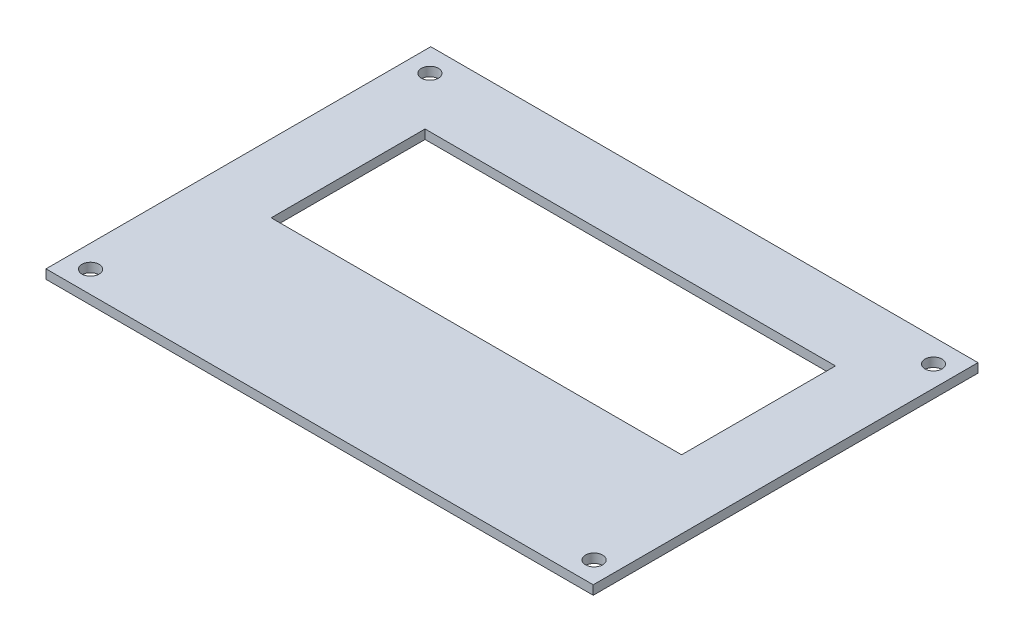
ISO-10303-21;
HEADER;
FILE_DESCRIPTION(('STEP AP214'),'2;1');
FILE_NAME('part.step','',(''),(''),'','','');
FILE_SCHEMA(('AUTOMOTIVE_DESIGN { 1 0 10303 214 1 1 1 1 }'));
ENDSEC;
DATA;
#1=APPLICATION_CONTEXT('core data for automotive mechanical design processes');
#2=APPLICATION_PROTOCOL_DEFINITION('international standard','automotive_design',2000,#1);
#3=PRODUCT_CONTEXT('',#1,'mechanical');
#4=PRODUCT('Part','Part','',(#3));
#5=PRODUCT_RELATED_PRODUCT_CATEGORY('part','',(#4));
#6=PRODUCT_DEFINITION_FORMATION('','',#4);
#7=PRODUCT_DEFINITION_CONTEXT('part definition',#1,'design');
#8=PRODUCT_DEFINITION('design','',#6,#7);
#9=PRODUCT_DEFINITION_SHAPE('','',#8);
#10=(LENGTH_UNIT() NAMED_UNIT(*) SI_UNIT(.MILLI.,.METRE.));
#11=(NAMED_UNIT(*) PLANE_ANGLE_UNIT() SI_UNIT($,.RADIAN.));
#12=(NAMED_UNIT(*) SI_UNIT($,.STERADIAN.) SOLID_ANGLE_UNIT());
#13=UNCERTAINTY_MEASURE_WITH_UNIT(LENGTH_MEASURE(1.E-05),#10,'distance_accuracy_value','');
#14=(GEOMETRIC_REPRESENTATION_CONTEXT(3) GLOBAL_UNCERTAINTY_ASSIGNED_CONTEXT((#13)) GLOBAL_UNIT_ASSIGNED_CONTEXT((#10,
#11,#12)) REPRESENTATION_CONTEXT('',''));
#15=CARTESIAN_POINT('',(0.,0.,0.));
#16=DIRECTION('',(0.,0.,1.));
#17=DIRECTION('',(1.,0.,0.));
#18=AXIS2_PLACEMENT_3D('',#15,#16,#17);
#19=CARTESIAN_POINT('',(0.,1.6,0.));
#20=DIRECTION('',(0.,0.,-1.));
#21=DIRECTION('',(-1.,0.,0.));
#22=AXIS2_PLACEMENT_3D('',#19,#20,#21);
#23=PLANE('',#22);
#24=DIRECTION('',(1.,0.,0.));
#25=VECTOR('',#24,1.);
#26=CARTESIAN_POINT('',(0.,0.,0.));
#27=LINE('',#26,#25);
#28=CARTESIAN_POINT('',(0.,0.,0.));
#29=VERTEX_POINT('',#28);
#30=CARTESIAN_POINT('',(96.,0.,0.));
#31=VERTEX_POINT('',#30);
#32=EDGE_CURVE('E182',#29,#31,#27,.T.);
#33=ORIENTED_EDGE('',*,*,#32,.T.);
#34=DIRECTION('',(0.,-1.,0.));
#35=VECTOR('',#34,1.);
#36=CARTESIAN_POINT('',(96.,1.6,0.));
#37=LINE('',#36,#35);
#38=CARTESIAN_POINT('',(96.,1.6,0.));
#39=VERTEX_POINT('',#38);
#40=EDGE_CURVE('E11',#39,#31,#37,.T.);
#41=ORIENTED_EDGE('',*,*,#40,.F.);
#42=DIRECTION('',(1.,0.,0.));
#43=VECTOR('',#42,1.);
#44=CARTESIAN_POINT('',(0.,1.6,0.));
#45=LINE('',#44,#43);
#46=CARTESIAN_POINT('',(0.,1.6,0.));
#47=VERTEX_POINT('',#46);
#48=EDGE_CURVE('E183',#47,#39,#45,.T.);
#49=ORIENTED_EDGE('',*,*,#48,.F.);
#50=DIRECTION('',(0.,-1.,0.));
#51=VECTOR('',#50,1.);
#52=CARTESIAN_POINT('',(0.,1.6,0.));
#53=LINE('',#52,#51);
#54=EDGE_CURVE('E199',#47,#29,#53,.T.);
#55=ORIENTED_EDGE('',*,*,#54,.T.);
#56=EDGE_LOOP('',(#33,#41,#49,#55));
#57=FACE_BOUND('',#56,.T.);
#58=ADVANCED_FACE('F37',(#57),#23,.F.);
#59=CARTESIAN_POINT('',(96.,1.6,0.));
#60=DIRECTION('',(-1.,0.,0.));
#61=DIRECTION('',(0.,0.,1.));
#62=AXIS2_PLACEMENT_3D('',#59,#60,#61);
#63=PLANE('',#62);
#64=DIRECTION('',(0.,0.,-1.));
#65=VECTOR('',#64,1.);
#66=CARTESIAN_POINT('',(96.,0.,0.));
#67=LINE('',#66,#65);
#68=CARTESIAN_POINT('',(96.,0.,-67.5));
#69=VERTEX_POINT('',#68);
#70=EDGE_CURVE('E203',#31,#69,#67,.T.);
#71=ORIENTED_EDGE('',*,*,#70,.T.);
#72=DIRECTION('',(0.,-1.,0.));
#73=VECTOR('',#72,1.);
#74=CARTESIAN_POINT('',(96.,1.6,-67.5));
#75=LINE('',#74,#73);
#76=CARTESIAN_POINT('',(96.,1.6,-67.5));
#77=VERTEX_POINT('',#76);
#78=EDGE_CURVE('E45',#77,#69,#75,.T.);
#79=ORIENTED_EDGE('',*,*,#78,.F.);
#80=DIRECTION('',(0.,0.,-1.));
#81=VECTOR('',#80,1.);
#82=CARTESIAN_POINT('',(96.,1.6,0.));
#83=LINE('',#82,#81);
#84=EDGE_CURVE('E187',#39,#77,#83,.T.);
#85=ORIENTED_EDGE('',*,*,#84,.F.);
#86=ORIENTED_EDGE('',*,*,#40,.T.);
#87=EDGE_LOOP('',(#71,#79,#85,#86));
#88=FACE_BOUND('',#87,.T.);
#89=ADVANCED_FACE('F225',(#88),#63,.F.);
#90=CARTESIAN_POINT('',(0.,1.6,-67.5));
#91=DIRECTION('',(0.,0.,-1.));
#92=DIRECTION('',(-1.,0.,0.));
#93=AXIS2_PLACEMENT_3D('',#90,#91,#92);
#94=PLANE('',#93);
#95=DIRECTION('',(1.,0.,0.));
#96=VECTOR('',#95,1.);
#97=CARTESIAN_POINT('',(0.,0.,-67.5));
#98=LINE('',#97,#96);
#99=CARTESIAN_POINT('',(0.,0.,-67.5));
#100=VERTEX_POINT('',#99);
#101=EDGE_CURVE('E207',#100,#69,#98,.T.);
#102=ORIENTED_EDGE('',*,*,#101,.F.);
#103=DIRECTION('',(0.,-1.,0.));
#104=VECTOR('',#103,1.);
#105=CARTESIAN_POINT('',(0.,1.6,-67.5));
#106=LINE('',#105,#104);
#107=CARTESIAN_POINT('',(0.,1.6,-67.5));
#108=VERTEX_POINT('',#107);
#109=EDGE_CURVE('E216',#108,#100,#106,.T.);
#110=ORIENTED_EDGE('',*,*,#109,.F.);
#111=DIRECTION('',(1.,0.,0.));
#112=VECTOR('',#111,1.);
#113=CARTESIAN_POINT('',(0.,1.6,-67.5));
#114=LINE('',#113,#112);
#115=EDGE_CURVE('E191',#108,#77,#114,.T.);
#116=ORIENTED_EDGE('',*,*,#115,.T.);
#117=ORIENTED_EDGE('',*,*,#78,.T.);
#118=EDGE_LOOP('',(#102,#110,#116,#117));
#119=FACE_BOUND('',#118,.T.);
#120=ADVANCED_FACE('F222',(#119),#94,.T.);
#121=CARTESIAN_POINT('',(0.,1.6,0.));
#122=DIRECTION('',(-1.,0.,0.));
#123=DIRECTION('',(0.,0.,1.));
#124=AXIS2_PLACEMENT_3D('',#121,#122,#123);
#125=PLANE('',#124);
#126=DIRECTION('',(0.,0.,-1.));
#127=VECTOR('',#126,1.);
#128=CARTESIAN_POINT('',(0.,0.,0.));
#129=LINE('',#128,#127);
#130=EDGE_CURVE('E188',#29,#100,#129,.T.);
#131=ORIENTED_EDGE('',*,*,#130,.F.);
#132=ORIENTED_EDGE('',*,*,#54,.F.);
#133=DIRECTION('',(0.,0.,-1.));
#134=VECTOR('',#133,1.);
#135=CARTESIAN_POINT('',(0.,1.6,0.));
#136=LINE('',#135,#134);
#137=EDGE_CURVE('E195',#47,#108,#136,.T.);
#138=ORIENTED_EDGE('',*,*,#137,.T.);
#139=ORIENTED_EDGE('',*,*,#109,.T.);
#140=EDGE_LOOP('',(#131,#132,#138,#139));
#141=FACE_BOUND('',#140,.T.);
#142=ADVANCED_FACE('F231',(#141),#125,.T.);
#143=CARTESIAN_POINT('',(0.,1.6,0.));
#144=DIRECTION('',(0.,1.,0.));
#145=DIRECTION('',(0.,0.,1.));
#146=AXIS2_PLACEMENT_3D('',#143,#144,#145);
#147=PLANE('',#146);
#148=DIRECTION('',(0.,0.,1.));
#149=VECTOR('',#148,1.);
#150=CARTESIAN_POINT('',(12.,1.6,0.));
#151=LINE('',#150,#149);
#152=CARTESIAN_POINT('',(12.,1.6,-54.5));
#153=VERTEX_POINT('',#152);
#154=CARTESIAN_POINT('',(12.,1.6,-27.5));
#155=VERTEX_POINT('',#154);
#156=EDGE_CURVE('E108',#153,#155,#151,.T.);
#157=ORIENTED_EDGE('',*,*,#156,.F.);
#158=DIRECTION('',(-1.,0.,0.));
#159=VECTOR('',#158,1.);
#160=CARTESIAN_POINT('',(0.,1.6,-54.5));
#161=LINE('',#160,#159);
#162=CARTESIAN_POINT('',(84.,1.6,-54.5));
#163=VERTEX_POINT('',#162);
#164=EDGE_CURVE('E147',#163,#153,#161,.T.);
#165=ORIENTED_EDGE('',*,*,#164,.F.);
#166=DIRECTION('',(0.,0.,-1.));
#167=VECTOR('',#166,1.);
#168=CARTESIAN_POINT('',(83.9999999999999,1.6,0.));
#169=LINE('',#168,#167);
#170=CARTESIAN_POINT('',(84.,1.6,-27.5));
#171=VERTEX_POINT('',#170);
#172=EDGE_CURVE('E144',#171,#163,#169,.T.);
#173=ORIENTED_EDGE('',*,*,#172,.F.);
#174=DIRECTION('',(1.,0.,0.));
#175=VECTOR('',#174,1.);
#176=CARTESIAN_POINT('',(0.,1.6,-27.5));
#177=LINE('',#176,#175);
#178=EDGE_CURVE('E135',#155,#171,#177,.T.);
#179=ORIENTED_EDGE('',*,*,#178,.F.);
#180=EDGE_LOOP('',(#157,#165,#173,#179));
#181=FACE_BOUND('',#180,.T.);
#182=CARTESIAN_POINT('',(92.3,1.6,-3.85));
#183=DIRECTION('',(0.,1.,0.));
#184=DIRECTION('',(0.,0.,1.));
#185=AXIS2_PLACEMENT_3D('',#182,#183,#184);
#186=CIRCLE('',#185,1.5);
#187=CARTESIAN_POINT('',(92.3,1.6,-2.35));
#188=VERTEX_POINT('',#187);
#189=EDGE_CURVE('E160',#188,#188,#186,.T.);
#190=ORIENTED_EDGE('',*,*,#189,.F.);
#191=EDGE_LOOP('',(#190));
#192=FACE_BOUND('',#191,.T.);
#193=CARTESIAN_POINT('',(3.96000000000002,1.6,-63.39));
#194=DIRECTION('',(0.,1.,0.));
#195=DIRECTION('',(0.,0.,1.));
#196=AXIS2_PLACEMENT_3D('',#193,#194,#195);
#197=CIRCLE('',#196,1.5);
#198=CARTESIAN_POINT('',(3.96000000000002,1.6,-61.89));
#199=VERTEX_POINT('',#198);
#200=EDGE_CURVE('E159',#199,#199,#197,.T.);
#201=ORIENTED_EDGE('',*,*,#200,.F.);
#202=EDGE_LOOP('',(#201));
#203=FACE_BOUND('',#202,.T.);
#204=CARTESIAN_POINT('',(92.3,1.6,-63.39));
#205=DIRECTION('',(0.,1.,0.));
#206=DIRECTION('',(0.,0.,1.));
#207=AXIS2_PLACEMENT_3D('',#204,#205,#206);
#208=CIRCLE('',#207,1.5);
#209=CARTESIAN_POINT('',(92.3,1.6,-61.89));
#210=VERTEX_POINT('',#209);
#211=EDGE_CURVE('E152',#210,#210,#208,.T.);
#212=ORIENTED_EDGE('',*,*,#211,.F.);
#213=EDGE_LOOP('',(#212));
#214=FACE_BOUND('',#213,.T.);
#215=CARTESIAN_POINT('',(3.96,1.6,-3.85));
#216=DIRECTION('',(0.,1.,0.));
#217=DIRECTION('',(0.,0.,1.));
#218=AXIS2_PLACEMENT_3D('',#215,#216,#217);
#219=CIRCLE('',#218,1.5);
#220=CARTESIAN_POINT('',(3.96,1.6,-2.35));
#221=VERTEX_POINT('',#220);
#222=EDGE_CURVE('E168',#221,#221,#219,.T.);
#223=ORIENTED_EDGE('',*,*,#222,.F.);
#224=EDGE_LOOP('',(#223));
#225=FACE_BOUND('',#224,.T.);
#226=ORIENTED_EDGE('',*,*,#48,.T.);
#227=ORIENTED_EDGE('',*,*,#84,.T.);
#228=ORIENTED_EDGE('',*,*,#115,.F.);
#229=ORIENTED_EDGE('',*,*,#137,.F.);
#230=EDGE_LOOP('',(#226,#227,#228,#229));
#231=FACE_BOUND('',#230,.T.);
#232=ADVANCED_FACE('F235',(#181,#192,#203,#214,#225,#231),#147,.T.);
#233=CARTESIAN_POINT('',(0.,0.,0.));
#234=DIRECTION('',(0.,1.,0.));
#235=DIRECTION('',(0.,0.,1.));
#236=AXIS2_PLACEMENT_3D('',#233,#234,#235);
#237=PLANE('',#236);
#238=DIRECTION('',(-1.,0.,0.));
#239=VECTOR('',#238,1.);
#240=CARTESIAN_POINT('',(12.,0.,-54.5));
#241=LINE('',#240,#239);
#242=CARTESIAN_POINT('',(84.,0.,-54.5));
#243=VERTEX_POINT('',#242);
#244=CARTESIAN_POINT('',(12.,0.,-54.5));
#245=VERTEX_POINT('',#244);
#246=EDGE_CURVE('E112',#243,#245,#241,.T.);
#247=ORIENTED_EDGE('',*,*,#246,.T.);
#248=DIRECTION('',(0.,0.,1.));
#249=VECTOR('',#248,1.);
#250=CARTESIAN_POINT('',(12.,0.,-54.5));
#251=LINE('',#250,#249);
#252=CARTESIAN_POINT('',(12.,0.,-27.5));
#253=VERTEX_POINT('',#252);
#254=EDGE_CURVE('E105',#245,#253,#251,.T.);
#255=ORIENTED_EDGE('',*,*,#254,.T.);
#256=DIRECTION('',(1.,0.,0.));
#257=VECTOR('',#256,1.);
#258=CARTESIAN_POINT('',(12.,0.,-27.5));
#259=LINE('',#258,#257);
#260=CARTESIAN_POINT('',(84.,0.,-27.5));
#261=VERTEX_POINT('',#260);
#262=EDGE_CURVE('E115',#253,#261,#259,.T.);
#263=ORIENTED_EDGE('',*,*,#262,.T.);
#264=DIRECTION('',(0.,0.,-1.));
#265=VECTOR('',#264,1.);
#266=CARTESIAN_POINT('',(84.,0.,-54.5));
#267=LINE('',#266,#265);
#268=EDGE_CURVE('E60',#261,#243,#267,.T.);
#269=ORIENTED_EDGE('',*,*,#268,.T.);
#270=EDGE_LOOP('',(#247,#255,#263,#269));
#271=FACE_BOUND('',#270,.T.);
#272=CARTESIAN_POINT('',(92.3,0.,-3.85));
#273=DIRECTION('',(0.,1.,0.));
#274=DIRECTION('',(0.,0.,1.));
#275=AXIS2_PLACEMENT_3D('',#272,#273,#274);
#276=CIRCLE('',#275,1.5);
#277=CARTESIAN_POINT('',(92.3,0.,-2.35));
#278=VERTEX_POINT('',#277);
#279=EDGE_CURVE('E163',#278,#278,#276,.F.);
#280=ORIENTED_EDGE('',*,*,#279,.F.);
#281=EDGE_LOOP('',(#280));
#282=FACE_BOUND('',#281,.T.);
#283=CARTESIAN_POINT('',(3.96000000000002,0.,-63.39));
#284=DIRECTION('',(0.,1.,0.));
#285=DIRECTION('',(0.,0.,1.));
#286=AXIS2_PLACEMENT_3D('',#283,#284,#285);
#287=CIRCLE('',#286,1.5);
#288=CARTESIAN_POINT('',(3.96000000000002,0.,-61.89));
#289=VERTEX_POINT('',#288);
#290=EDGE_CURVE('E164',#289,#289,#287,.F.);
#291=ORIENTED_EDGE('',*,*,#290,.F.);
#292=EDGE_LOOP('',(#291));
#293=FACE_BOUND('',#292,.T.);
#294=CARTESIAN_POINT('',(92.3,0.,-63.39));
#295=DIRECTION('',(0.,1.,0.));
#296=DIRECTION('',(0.,0.,1.));
#297=AXIS2_PLACEMENT_3D('',#294,#295,#296);
#298=CIRCLE('',#297,1.5);
#299=CARTESIAN_POINT('',(92.3,0.,-61.89));
#300=VERTEX_POINT('',#299);
#301=EDGE_CURVE('E156',#300,#300,#298,.F.);
#302=ORIENTED_EDGE('',*,*,#301,.F.);
#303=EDGE_LOOP('',(#302));
#304=FACE_BOUND('',#303,.T.);
#305=CARTESIAN_POINT('',(3.96,0.,-3.85));
#306=DIRECTION('',(0.,1.,0.));
#307=DIRECTION('',(0.,0.,1.));
#308=AXIS2_PLACEMENT_3D('',#305,#306,#307);
#309=CIRCLE('',#308,1.5);
#310=CARTESIAN_POINT('',(3.96,0.,-2.35));
#311=VERTEX_POINT('',#310);
#312=EDGE_CURVE('E178',#311,#311,#309,.F.);
#313=ORIENTED_EDGE('',*,*,#312,.F.);
#314=EDGE_LOOP('',(#313));
#315=FACE_BOUND('',#314,.T.);
#316=ORIENTED_EDGE('',*,*,#32,.F.);
#317=ORIENTED_EDGE('',*,*,#130,.T.);
#318=ORIENTED_EDGE('',*,*,#101,.T.);
#319=ORIENTED_EDGE('',*,*,#70,.F.);
#320=EDGE_LOOP('',(#316,#317,#318,#319));
#321=FACE_BOUND('',#320,.T.);
#322=ADVANCED_FACE('F120',(#271,#282,#293,#304,#315,#321),#237,.F.);
#323=CARTESIAN_POINT('',(3.96,-0.000999999999999916,-3.85));
#324=DIRECTION('',(0.,1.,0.));
#325=DIRECTION('',(0.,0.,1.));
#326=AXIS2_PLACEMENT_3D('',#323,#324,#325);
#327=CYLINDRICAL_SURFACE('',#326,1.5);
#328=ORIENTED_EDGE('',*,*,#222,.T.);
#329=EDGE_LOOP('',(#328));
#330=FACE_BOUND('',#329,.T.);
#331=ORIENTED_EDGE('',*,*,#312,.T.);
#332=EDGE_LOOP('',(#331));
#333=FACE_BOUND('',#332,.T.);
#334=ADVANCED_FACE('F250',(#330,#333),#327,.F.);
#335=CARTESIAN_POINT('',(92.3,-0.000999999999999916,-63.39));
#336=DIRECTION('',(0.,1.,0.));
#337=DIRECTION('',(0.,0.,1.));
#338=AXIS2_PLACEMENT_3D('',#335,#336,#337);
#339=CYLINDRICAL_SURFACE('',#338,1.5);
#340=ORIENTED_EDGE('',*,*,#211,.T.);
#341=EDGE_LOOP('',(#340));
#342=FACE_BOUND('',#341,.T.);
#343=ORIENTED_EDGE('',*,*,#301,.T.);
#344=EDGE_LOOP('',(#343));
#345=FACE_BOUND('',#344,.T.);
#346=ADVANCED_FACE('F256',(#342,#345),#339,.F.);
#347=CARTESIAN_POINT('',(3.96000000000002,-0.000999999999999916,-63.39));
#348=DIRECTION('',(0.,1.,0.));
#349=DIRECTION('',(0.,0.,1.));
#350=AXIS2_PLACEMENT_3D('',#347,#348,#349);
#351=CYLINDRICAL_SURFACE('',#350,1.5);
#352=ORIENTED_EDGE('',*,*,#200,.T.);
#353=EDGE_LOOP('',(#352));
#354=FACE_BOUND('',#353,.T.);
#355=ORIENTED_EDGE('',*,*,#290,.T.);
#356=EDGE_LOOP('',(#355));
#357=FACE_BOUND('',#356,.T.);
#358=ADVANCED_FACE('F258',(#354,#357),#351,.F.);
#359=CARTESIAN_POINT('',(92.3,-0.000999999999999916,-3.85));
#360=DIRECTION('',(0.,1.,0.));
#361=DIRECTION('',(0.,0.,1.));
#362=AXIS2_PLACEMENT_3D('',#359,#360,#361);
#363=CYLINDRICAL_SURFACE('',#362,1.5);
#364=ORIENTED_EDGE('',*,*,#189,.T.);
#365=EDGE_LOOP('',(#364));
#366=FACE_BOUND('',#365,.T.);
#367=ORIENTED_EDGE('',*,*,#279,.T.);
#368=EDGE_LOOP('',(#367));
#369=FACE_BOUND('',#368,.T.);
#370=ADVANCED_FACE('F261',(#366,#369),#363,.F.);
#371=CARTESIAN_POINT('',(12.,0.,-54.5));
#372=DIRECTION('',(-1.,0.,0.));
#373=DIRECTION('',(0.,0.,1.));
#374=AXIS2_PLACEMENT_3D('',#371,#372,#373);
#375=PLANE('',#374);
#376=ORIENTED_EDGE('',*,*,#156,.T.);
#377=DIRECTION('',(0.,1.,0.));
#378=VECTOR('',#377,1.);
#379=CARTESIAN_POINT('',(12.,0.,-27.5));
#380=LINE('',#379,#378);
#381=EDGE_CURVE('E52',#253,#155,#380,.T.);
#382=ORIENTED_EDGE('',*,*,#381,.F.);
#383=ORIENTED_EDGE('',*,*,#254,.F.);
#384=DIRECTION('',(0.,1.,0.));
#385=VECTOR('',#384,1.);
#386=CARTESIAN_POINT('',(12.,0.,-54.5));
#387=LINE('',#386,#385);
#388=EDGE_CURVE('E132',#245,#153,#387,.T.);
#389=ORIENTED_EDGE('',*,*,#388,.T.);
#390=EDGE_LOOP('',(#376,#382,#383,#389));
#391=FACE_BOUND('',#390,.T.);
#392=ADVANCED_FACE('F102',(#391),#375,.F.);
#393=CARTESIAN_POINT('',(12.,0.,-54.5));
#394=DIRECTION('',(0.,0.,-1.));
#395=DIRECTION('',(-1.,0.,0.));
#396=AXIS2_PLACEMENT_3D('',#393,#394,#395);
#397=PLANE('',#396);
#398=ORIENTED_EDGE('',*,*,#164,.T.);
#399=ORIENTED_EDGE('',*,*,#388,.F.);
#400=ORIENTED_EDGE('',*,*,#246,.F.);
#401=DIRECTION('',(0.,1.,0.));
#402=VECTOR('',#401,1.);
#403=CARTESIAN_POINT('',(84.,0.,-54.5));
#404=LINE('',#403,#402);
#405=EDGE_CURVE('E136',#243,#163,#404,.T.);
#406=ORIENTED_EDGE('',*,*,#405,.T.);
#407=EDGE_LOOP('',(#398,#399,#400,#406));
#408=FACE_BOUND('',#407,.T.);
#409=ADVANCED_FACE('F271',(#408),#397,.F.);
#410=CARTESIAN_POINT('',(84.,0.,-54.5));
#411=DIRECTION('',(1.,0.,0.));
#412=DIRECTION('',(0.,0.,-1.));
#413=AXIS2_PLACEMENT_3D('',#410,#411,#412);
#414=PLANE('',#413);
#415=ORIENTED_EDGE('',*,*,#172,.T.);
#416=ORIENTED_EDGE('',*,*,#405,.F.);
#417=ORIENTED_EDGE('',*,*,#268,.F.);
#418=DIRECTION('',(0.,1.,0.));
#419=VECTOR('',#418,1.);
#420=CARTESIAN_POINT('',(84.,0.,-27.5));
#421=LINE('',#420,#419);
#422=EDGE_CURVE('E111',#261,#171,#421,.T.);
#423=ORIENTED_EDGE('',*,*,#422,.T.);
#424=EDGE_LOOP('',(#415,#416,#417,#423));
#425=FACE_BOUND('',#424,.T.);
#426=ADVANCED_FACE('F274',(#425),#414,.F.);
#427=CARTESIAN_POINT('',(12.,0.,-27.5));
#428=DIRECTION('',(0.,0.,1.));
#429=DIRECTION('',(1.,0.,0.));
#430=AXIS2_PLACEMENT_3D('',#427,#428,#429);
#431=PLANE('',#430);
#432=ORIENTED_EDGE('',*,*,#178,.T.);
#433=ORIENTED_EDGE('',*,*,#422,.F.);
#434=ORIENTED_EDGE('',*,*,#262,.F.);
#435=ORIENTED_EDGE('',*,*,#381,.T.);
#436=EDGE_LOOP('',(#432,#433,#434,#435));
#437=FACE_BOUND('',#436,.T.);
#438=ADVANCED_FACE('F116',(#437),#431,.F.);
#439=CLOSED_SHELL('',(#58,#89,#120,#142,#232,#322,#334,#346,#358,#370,#392,#409,#426,#438));
#440=MANIFOLD_SOLID_BREP('B2',#439);
#441=ADVANCED_BREP_SHAPE_REPRESENTATION('',(#18,#440),#14);
#442=SHAPE_DEFINITION_REPRESENTATION(#9,#441);
ENDSEC;
END-ISO-10303-21;
